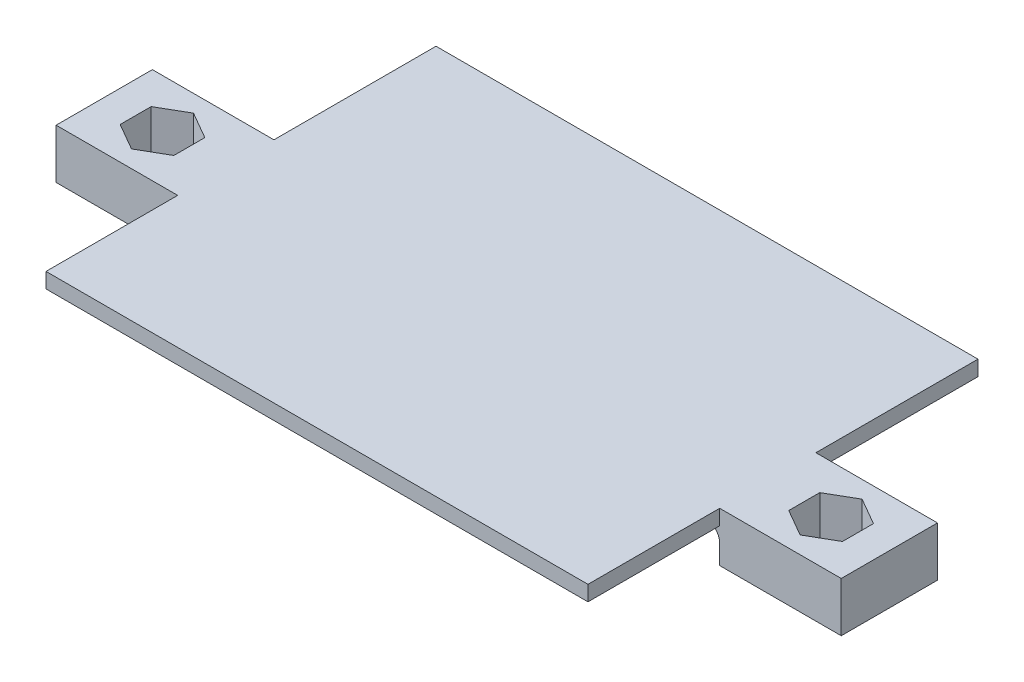
ISO-10303-21;
HEADER;
FILE_DESCRIPTION(('STEP AP214'),'2;1');
FILE_NAME('part.step','',(''),(''),'','','');
FILE_SCHEMA(('AUTOMOTIVE_DESIGN { 1 0 10303 214 1 1 1 1 }'));
ENDSEC;
DATA;
#1=APPLICATION_CONTEXT('core data for automotive mechanical design processes');
#2=APPLICATION_PROTOCOL_DEFINITION('international standard','automotive_design',2000,#1);
#3=PRODUCT_CONTEXT('',#1,'mechanical');
#4=PRODUCT('Part','Part','',(#3));
#5=PRODUCT_RELATED_PRODUCT_CATEGORY('part','',(#4));
#6=PRODUCT_DEFINITION_FORMATION('','',#4);
#7=PRODUCT_DEFINITION_CONTEXT('part definition',#1,'design');
#8=PRODUCT_DEFINITION('design','',#6,#7);
#9=PRODUCT_DEFINITION_SHAPE('','',#8);
#10=(LENGTH_UNIT() NAMED_UNIT(*) SI_UNIT(.MILLI.,.METRE.));
#11=(NAMED_UNIT(*) PLANE_ANGLE_UNIT() SI_UNIT($,.RADIAN.));
#12=(NAMED_UNIT(*) SI_UNIT($,.STERADIAN.) SOLID_ANGLE_UNIT());
#13=UNCERTAINTY_MEASURE_WITH_UNIT(LENGTH_MEASURE(1.E-05),#10,'distance_accuracy_value','');
#14=(GEOMETRIC_REPRESENTATION_CONTEXT(3) GLOBAL_UNCERTAINTY_ASSIGNED_CONTEXT((#13)) GLOBAL_UNIT_ASSIGNED_CONTEXT((#10,
#11,#12)) REPRESENTATION_CONTEXT('',''));
#15=CARTESIAN_POINT('',(0.,0.,0.));
#16=DIRECTION('',(0.,0.,1.));
#17=DIRECTION('',(1.,0.,0.));
#18=AXIS2_PLACEMENT_3D('',#15,#16,#17);
#19=CARTESIAN_POINT('',(26.75,-1.5,-19.25));
#20=DIRECTION('',(-1.,0.,0.));
#21=DIRECTION('',(0.,0.,1.));
#22=AXIS2_PLACEMENT_3D('',#19,#20,#21);
#23=PLANE('',#22);
#24=DIRECTION('',(0.,1.,0.));
#25=VECTOR('',#24,1.);
#26=CARTESIAN_POINT('',(26.75,-4.9,-3.25000000000001));
#27=LINE('',#26,#25);
#28=CARTESIAN_POINT('',(26.75,-1.5,-3.25000000000001));
#29=VERTEX_POINT('',#28);
#30=CARTESIAN_POINT('',(26.75,0.,-3.25000000000001));
#31=VERTEX_POINT('',#30);
#32=EDGE_CURVE('E441',#29,#31,#27,.T.);
#33=ORIENTED_EDGE('',*,*,#32,.F.);
#34=DIRECTION('',(0.,0.,1.));
#35=VECTOR('',#34,1.);
#36=CARTESIAN_POINT('',(26.75,-1.5,-19.25));
#37=LINE('',#36,#35);
#38=CARTESIAN_POINT('',(26.75,-1.5,-19.25));
#39=VERTEX_POINT('',#38);
#40=EDGE_CURVE('E404',#39,#29,#37,.T.);
#41=ORIENTED_EDGE('',*,*,#40,.F.);
#42=DIRECTION('',(0.,1.,0.));
#43=VECTOR('',#42,1.);
#44=CARTESIAN_POINT('',(26.75,-1.5,-19.25));
#45=LINE('',#44,#43);
#46=CARTESIAN_POINT('',(26.75,0.,-19.25));
#47=VERTEX_POINT('',#46);
#48=EDGE_CURVE('E424',#39,#47,#45,.T.);
#49=ORIENTED_EDGE('',*,*,#48,.T.);
#50=DIRECTION('',(0.,0.,1.));
#51=VECTOR('',#50,1.);
#52=CARTESIAN_POINT('',(26.75,0.,-19.25));
#53=LINE('',#52,#51);
#54=EDGE_CURVE('E394',#47,#31,#53,.T.);
#55=ORIENTED_EDGE('',*,*,#54,.T.);
#56=EDGE_LOOP('',(#33,#41,#49,#55));
#57=FACE_BOUND('',#56,.T.);
#58=ADVANCED_FACE('F43',(#57),#23,.F.);
#59=CARTESIAN_POINT('',(-26.75,-1.5,-19.25));
#60=DIRECTION('',(-1.,0.,0.));
#61=DIRECTION('',(0.,0.,1.));
#62=AXIS2_PLACEMENT_3D('',#59,#60,#61);
#63=PLANE('',#62);
#64=DIRECTION('',(0.,0.,1.));
#65=VECTOR('',#64,1.);
#66=CARTESIAN_POINT('',(-26.75,-1.5,-19.25));
#67=LINE('',#66,#65);
#68=CARTESIAN_POINT('',(-26.75,-1.5,-19.25));
#69=VERTEX_POINT('',#68);
#70=CARTESIAN_POINT('',(-26.75,-1.5,-3.25));
#71=VERTEX_POINT('',#70);
#72=EDGE_CURVE('E395',#69,#71,#67,.T.);
#73=ORIENTED_EDGE('',*,*,#72,.T.);
#74=DIRECTION('',(0.,1.,0.));
#75=VECTOR('',#74,1.);
#76=CARTESIAN_POINT('',(-26.75,-4.9,-3.25));
#77=LINE('',#76,#75);
#78=CARTESIAN_POINT('',(-26.75,0.,-3.25));
#79=VERTEX_POINT('',#78);
#80=EDGE_CURVE('E382',#71,#79,#77,.T.);
#81=ORIENTED_EDGE('',*,*,#80,.T.);
#82=DIRECTION('',(0.,0.,1.));
#83=VECTOR('',#82,1.);
#84=CARTESIAN_POINT('',(-26.75,0.,-19.25));
#85=LINE('',#84,#83);
#86=CARTESIAN_POINT('',(-26.75,0.,-19.25));
#87=VERTEX_POINT('',#86);
#88=EDGE_CURVE('E412',#87,#79,#85,.T.);
#89=ORIENTED_EDGE('',*,*,#88,.F.);
#90=DIRECTION('',(0.,1.,0.));
#91=VECTOR('',#90,1.);
#92=CARTESIAN_POINT('',(-26.75,-1.5,-19.25));
#93=LINE('',#92,#91);
#94=EDGE_CURVE('E407',#69,#87,#93,.T.);
#95=ORIENTED_EDGE('',*,*,#94,.F.);
#96=EDGE_LOOP('',(#73,#81,#89,#95));
#97=FACE_BOUND('',#96,.T.);
#98=ADVANCED_FACE('F603',(#97),#63,.T.);
#99=CARTESIAN_POINT('',(26.75,-1.5,-19.25));
#100=DIRECTION('',(0.,0.,-1.));
#101=DIRECTION('',(-1.,0.,0.));
#102=AXIS2_PLACEMENT_3D('',#99,#100,#101);
#103=PLANE('',#102);
#104=DIRECTION('',(-1.,0.,0.));
#105=VECTOR('',#104,1.);
#106=CARTESIAN_POINT('',(26.75,0.,-19.25));
#107=LINE('',#106,#105);
#108=EDGE_CURVE('E376',#47,#87,#107,.T.);
#109=ORIENTED_EDGE('',*,*,#108,.F.);
#110=ORIENTED_EDGE('',*,*,#48,.F.);
#111=DIRECTION('',(-1.,0.,0.));
#112=VECTOR('',#111,1.);
#113=CARTESIAN_POINT('',(26.75,-1.5,-19.25));
#114=LINE('',#113,#112);
#115=EDGE_CURVE('E389',#39,#69,#114,.T.);
#116=ORIENTED_EDGE('',*,*,#115,.T.);
#117=ORIENTED_EDGE('',*,*,#94,.T.);
#118=EDGE_LOOP('',(#109,#110,#116,#117));
#119=FACE_BOUND('',#118,.T.);
#120=ADVANCED_FACE('F608',(#119),#103,.T.);
#121=CARTESIAN_POINT('',(26.75,-1.5,6.25));
#122=VERTEX_POINT('',#121);
#123=CARTESIAN_POINT('',(26.75,-1.5,19.25));
#124=VERTEX_POINT('',#123);
#125=EDGE_CURVE('E403',#122,#124,#37,.T.);
#126=ORIENTED_EDGE('',*,*,#125,.F.);
#127=DIRECTION('',(0.,1.,0.));
#128=VECTOR('',#127,1.);
#129=CARTESIAN_POINT('',(26.75,-4.9,6.25));
#130=LINE('',#129,#128);
#131=CARTESIAN_POINT('',(26.75,0.,6.25));
#132=VERTEX_POINT('',#131);
#133=EDGE_CURVE('E489',#122,#132,#130,.T.);
#134=ORIENTED_EDGE('',*,*,#133,.T.);
#135=CARTESIAN_POINT('',(26.75,0.,19.25));
#136=VERTEX_POINT('',#135);
#137=EDGE_CURVE('E420',#132,#136,#53,.T.);
#138=ORIENTED_EDGE('',*,*,#137,.T.);
#139=DIRECTION('',(0.,1.,0.));
#140=VECTOR('',#139,1.);
#141=CARTESIAN_POINT('',(26.75,-1.5,19.25));
#142=LINE('',#141,#140);
#143=EDGE_CURVE('E427',#124,#136,#142,.T.);
#144=ORIENTED_EDGE('',*,*,#143,.F.);
#145=EDGE_LOOP('',(#126,#134,#138,#144));
#146=FACE_BOUND('',#145,.T.);
#147=ADVANCED_FACE('F604',(#146),#23,.F.);
#148=CARTESIAN_POINT('',(26.75,-1.5,19.25));
#149=DIRECTION('',(0.,0.,-1.));
#150=DIRECTION('',(-1.,0.,0.));
#151=AXIS2_PLACEMENT_3D('',#148,#149,#150);
#152=PLANE('',#151);
#153=DIRECTION('',(-1.,0.,0.));
#154=VECTOR('',#153,1.);
#155=CARTESIAN_POINT('',(26.75,0.,19.25));
#156=LINE('',#155,#154);
#157=CARTESIAN_POINT('',(-26.75,0.,19.25));
#158=VERTEX_POINT('',#157);
#159=EDGE_CURVE('E416',#136,#158,#156,.T.);
#160=ORIENTED_EDGE('',*,*,#159,.T.);
#161=DIRECTION('',(0.,1.,0.));
#162=VECTOR('',#161,1.);
#163=CARTESIAN_POINT('',(-26.75,-1.5,19.25));
#164=LINE('',#163,#162);
#165=CARTESIAN_POINT('',(-26.75,-1.5,19.25));
#166=VERTEX_POINT('',#165);
#167=EDGE_CURVE('E431',#166,#158,#164,.T.);
#168=ORIENTED_EDGE('',*,*,#167,.F.);
#169=DIRECTION('',(-1.,0.,0.));
#170=VECTOR('',#169,1.);
#171=CARTESIAN_POINT('',(26.75,-1.5,19.25));
#172=LINE('',#171,#170);
#173=EDGE_CURVE('E399',#124,#166,#172,.T.);
#174=ORIENTED_EDGE('',*,*,#173,.F.);
#175=ORIENTED_EDGE('',*,*,#143,.T.);
#176=EDGE_LOOP('',(#160,#168,#174,#175));
#177=FACE_BOUND('',#176,.T.);
#178=ADVANCED_FACE('F613',(#177),#152,.F.);
#179=DIRECTION('',(0.,1.,0.));
#180=VECTOR('',#179,1.);
#181=CARTESIAN_POINT('',(-26.75,-4.9,6.25000000000001));
#182=LINE('',#181,#180);
#183=CARTESIAN_POINT('',(-26.75,-1.5,6.25000000000001));
#184=VERTEX_POINT('',#183);
#185=CARTESIAN_POINT('',(-26.75,0.,6.25000000000001));
#186=VERTEX_POINT('',#185);
#187=EDGE_CURVE('E386',#184,#186,#182,.T.);
#188=ORIENTED_EDGE('',*,*,#187,.F.);
#189=EDGE_CURVE('E393',#184,#166,#67,.T.);
#190=ORIENTED_EDGE('',*,*,#189,.T.);
#191=ORIENTED_EDGE('',*,*,#167,.T.);
#192=EDGE_CURVE('E411',#186,#158,#85,.T.);
#193=ORIENTED_EDGE('',*,*,#192,.F.);
#194=EDGE_LOOP('',(#188,#190,#191,#193));
#195=FACE_BOUND('',#194,.T.);
#196=ADVANCED_FACE('F598',(#195),#63,.T.);
#197=CARTESIAN_POINT('',(0.,-1.5,0.));
#198=DIRECTION('',(0.,1.,0.));
#199=DIRECTION('',(0.,0.,1.));
#200=AXIS2_PLACEMENT_3D('',#197,#198,#199);
#201=PLANE('',#200);
#202=ORIENTED_EDGE('',*,*,#189,.F.);
#203=DIRECTION('',(1.,0.,0.));
#204=VECTOR('',#203,1.);
#205=CARTESIAN_POINT('',(0.,-1.5,6.25000000000001));
#206=LINE('',#205,#204);
#207=CARTESIAN_POINT('',(-25.25,-1.5,6.25000000000001));
#208=VERTEX_POINT('',#207);
#209=EDGE_CURVE('E66',#184,#208,#206,.T.);
#210=ORIENTED_EDGE('',*,*,#209,.T.);
#211=DIRECTION('',(0.,0.,1.));
#212=VECTOR('',#211,1.);
#213=CARTESIAN_POINT('',(-25.25,-1.5,0.));
#214=LINE('',#213,#212);
#215=CARTESIAN_POINT('',(-25.25,-1.5,-3.25));
#216=VERTEX_POINT('',#215);
#217=EDGE_CURVE('E454',#208,#216,#214,.F.);
#218=ORIENTED_EDGE('',*,*,#217,.T.);
#219=DIRECTION('',(-1.,0.,0.));
#220=VECTOR('',#219,1.);
#221=CARTESIAN_POINT('',(0.,-1.5,-3.25));
#222=LINE('',#221,#220);
#223=EDGE_CURVE('E451',#216,#71,#222,.T.);
#224=ORIENTED_EDGE('',*,*,#223,.T.);
#225=ORIENTED_EDGE('',*,*,#72,.F.);
#226=ORIENTED_EDGE('',*,*,#115,.F.);
#227=ORIENTED_EDGE('',*,*,#40,.T.);
#228=DIRECTION('',(-1.,0.,0.));
#229=VECTOR('',#228,1.);
#230=CARTESIAN_POINT('',(0.,-1.5,-3.25));
#231=LINE('',#230,#229);
#232=CARTESIAN_POINT('',(25.25,-1.5,-3.25000000000001));
#233=VERTEX_POINT('',#232);
#234=EDGE_CURVE('E58',#29,#233,#231,.T.);
#235=ORIENTED_EDGE('',*,*,#234,.T.);
#236=DIRECTION('',(0.,0.,1.));
#237=VECTOR('',#236,1.);
#238=CARTESIAN_POINT('',(25.25,-1.5,0.));
#239=LINE('',#238,#237);
#240=CARTESIAN_POINT('',(25.25,-1.5,6.25));
#241=VERTEX_POINT('',#240);
#242=EDGE_CURVE('E444',#233,#241,#239,.T.);
#243=ORIENTED_EDGE('',*,*,#242,.T.);
#244=DIRECTION('',(1.,0.,0.));
#245=VECTOR('',#244,1.);
#246=CARTESIAN_POINT('',(0.,-1.5,6.25000000000001));
#247=LINE('',#246,#245);
#248=EDGE_CURVE('E448',#241,#122,#247,.T.);
#249=ORIENTED_EDGE('',*,*,#248,.T.);
#250=ORIENTED_EDGE('',*,*,#125,.T.);
#251=ORIENTED_EDGE('',*,*,#173,.T.);
#252=EDGE_LOOP('',(#202,#210,#218,#224,#225,#226,#227,#235,#243,#249,#250,#251));
#253=FACE_BOUND('',#252,.T.);
#254=ADVANCED_FACE('F495',(#253),#201,.F.);
#255=CARTESIAN_POINT('',(0.,0.,0.));
#256=DIRECTION('',(0.,1.,0.));
#257=DIRECTION('',(0.,0.,1.));
#258=AXIS2_PLACEMENT_3D('',#255,#256,#257);
#259=PLANE('',#258);
#260=ORIENTED_EDGE('',*,*,#108,.T.);
#261=ORIENTED_EDGE('',*,*,#88,.T.);
#262=DIRECTION('',(-1.,0.,0.));
#263=VECTOR('',#262,1.);
#264=CARTESIAN_POINT('',(-38.75,0.,-3.25));
#265=LINE('',#264,#263);
#266=CARTESIAN_POINT('',(-38.75,0.,-3.25));
#267=VERTEX_POINT('',#266);
#268=EDGE_CURVE('E350',#79,#267,#265,.T.);
#269=ORIENTED_EDGE('',*,*,#268,.T.);
#270=DIRECTION('',(0.,0.,1.));
#271=VECTOR('',#270,1.);
#272=CARTESIAN_POINT('',(-38.75,0.,6.25000000000001));
#273=LINE('',#272,#271);
#274=CARTESIAN_POINT('',(-38.75,0.,6.25000000000001));
#275=VERTEX_POINT('',#274);
#276=EDGE_CURVE('E329',#267,#275,#273,.T.);
#277=ORIENTED_EDGE('',*,*,#276,.T.);
#278=DIRECTION('',(1.,0.,0.));
#279=VECTOR('',#278,1.);
#280=CARTESIAN_POINT('',(-38.75,0.,6.25000000000001));
#281=LINE('',#280,#279);
#282=EDGE_CURVE('E366',#275,#186,#281,.T.);
#283=ORIENTED_EDGE('',*,*,#282,.T.);
#284=ORIENTED_EDGE('',*,*,#192,.T.);
#285=ORIENTED_EDGE('',*,*,#159,.F.);
#286=ORIENTED_EDGE('',*,*,#137,.F.);
#287=DIRECTION('',(1.,0.,0.));
#288=VECTOR('',#287,1.);
#289=CARTESIAN_POINT('',(38.75,0.,6.25));
#290=LINE('',#289,#288);
#291=CARTESIAN_POINT('',(38.75,0.,6.25));
#292=VERTEX_POINT('',#291);
#293=EDGE_CURVE('E524',#132,#292,#290,.T.);
#294=ORIENTED_EDGE('',*,*,#293,.T.);
#295=DIRECTION('',(0.,0.,-1.));
#296=VECTOR('',#295,1.);
#297=CARTESIAN_POINT('',(38.75,0.,6.25));
#298=LINE('',#297,#296);
#299=CARTESIAN_POINT('',(38.75,0.,-3.25000000000001));
#300=VERTEX_POINT('',#299);
#301=EDGE_CURVE('E986',#292,#300,#298,.T.);
#302=ORIENTED_EDGE('',*,*,#301,.T.);
#303=DIRECTION('',(-1.,0.,0.));
#304=VECTOR('',#303,1.);
#305=CARTESIAN_POINT('',(38.75,0.,-3.25000000000001));
#306=LINE('',#305,#304);
#307=EDGE_CURVE('E532',#300,#31,#306,.T.);
#308=ORIENTED_EDGE('',*,*,#307,.T.);
#309=ORIENTED_EDGE('',*,*,#54,.F.);
#310=EDGE_LOOP('',(#260,#261,#269,#277,#283,#284,#285,#286,#294,#302,#308,#309));
#311=FACE_BOUND('',#310,.T.);
#312=DIRECTION('',(0.866025403784439,0.,-0.499999999999999));
#313=VECTOR('',#312,1.);
#314=CARTESIAN_POINT('',(-33.,0.,4.55995642670502));
#315=LINE('',#314,#313);
#316=CARTESIAN_POINT('',(-33.,0.,4.55995642670502));
#317=VERTEX_POINT('',#316);
#318=CARTESIAN_POINT('',(-30.35,0.,3.02997821335251));
#319=VERTEX_POINT('',#318);
#320=EDGE_CURVE('E306',#317,#319,#315,.T.);
#321=ORIENTED_EDGE('',*,*,#320,.F.);
#322=DIRECTION('',(0.866025403784438,0.,0.5));
#323=VECTOR('',#322,1.);
#324=CARTESIAN_POINT('',(-35.65,0.,3.02997821335251));
#325=LINE('',#324,#323);
#326=CARTESIAN_POINT('',(-35.65,0.,3.02997821335251));
#327=VERTEX_POINT('',#326);
#328=EDGE_CURVE('E303',#327,#317,#325,.T.);
#329=ORIENTED_EDGE('',*,*,#328,.F.);
#330=DIRECTION('',(0.,0.,1.));
#331=VECTOR('',#330,1.);
#332=CARTESIAN_POINT('',(-35.65,0.,-0.0299782133525008));
#333=LINE('',#332,#331);
#334=CARTESIAN_POINT('',(-35.65,0.,-0.0299782133525008));
#335=VERTEX_POINT('',#334);
#336=EDGE_CURVE('E282',#335,#327,#333,.T.);
#337=ORIENTED_EDGE('',*,*,#336,.F.);
#338=DIRECTION('',(-0.866025403784439,0.,0.5));
#339=VECTOR('',#338,1.);
#340=CARTESIAN_POINT('',(-33.,0.,-1.55995642670501));
#341=LINE('',#340,#339);
#342=CARTESIAN_POINT('',(-33.,0.,-1.55995642670501));
#343=VERTEX_POINT('',#342);
#344=EDGE_CURVE('E319',#343,#335,#341,.T.);
#345=ORIENTED_EDGE('',*,*,#344,.F.);
#346=DIRECTION('',(-0.866025403784439,0.,-0.5));
#347=VECTOR('',#346,1.);
#348=CARTESIAN_POINT('',(-30.35,0.,-0.0299782133525071));
#349=LINE('',#348,#347);
#350=CARTESIAN_POINT('',(-30.35,0.,-0.0299782133525071));
#351=VERTEX_POINT('',#350);
#352=EDGE_CURVE('E315',#351,#343,#349,.T.);
#353=ORIENTED_EDGE('',*,*,#352,.F.);
#354=DIRECTION('',(0.,0.,-1.));
#355=VECTOR('',#354,1.);
#356=CARTESIAN_POINT('',(-30.35,0.,3.02997821335251));
#357=LINE('',#356,#355);
#358=EDGE_CURVE('E311',#319,#351,#357,.T.);
#359=ORIENTED_EDGE('',*,*,#358,.F.);
#360=EDGE_LOOP('',(#321,#329,#337,#345,#353,#359));
#361=FACE_BOUND('',#360,.T.);
#362=DIRECTION('',(0.,0.,-1.));
#363=VECTOR('',#362,1.);
#364=CARTESIAN_POINT('',(35.65,0.,-0.0299782133525097));
#365=LINE('',#364,#363);
#366=CARTESIAN_POINT('',(35.65,0.,3.0299782133525));
#367=VERTEX_POINT('',#366);
#368=CARTESIAN_POINT('',(35.65,0.,-0.0299782133525075));
#369=VERTEX_POINT('',#368);
#370=EDGE_CURVE('E307',#367,#369,#365,.T.);
#371=ORIENTED_EDGE('',*,*,#370,.F.);
#372=DIRECTION('',(0.866025403784438,0.,-0.500000000000001));
#373=VECTOR('',#372,1.);
#374=CARTESIAN_POINT('',(35.65,0.,3.0299782133525));
#375=LINE('',#374,#373);
#376=CARTESIAN_POINT('',(33.,0.,4.55995642670501));
#377=VERTEX_POINT('',#376);
#378=EDGE_CURVE('E273',#377,#367,#375,.T.);
#379=ORIENTED_EDGE('',*,*,#378,.F.);
#380=DIRECTION('',(0.866025403784438,0.,0.5));
#381=VECTOR('',#380,1.);
#382=CARTESIAN_POINT('',(33.,0.,4.55995642670501));
#383=LINE('',#382,#381);
#384=CARTESIAN_POINT('',(30.35,0.,3.0299782133525));
#385=VERTEX_POINT('',#384);
#386=EDGE_CURVE('E550',#385,#377,#383,.T.);
#387=ORIENTED_EDGE('',*,*,#386,.F.);
#388=DIRECTION('',(0.,0.,1.));
#389=VECTOR('',#388,1.);
#390=CARTESIAN_POINT('',(30.35,0.,3.0299782133525));
#391=LINE('',#390,#389);
#392=CARTESIAN_POINT('',(30.35,0.,-0.0299782133525146));
#393=VERTEX_POINT('',#392);
#394=EDGE_CURVE('E554',#393,#385,#391,.T.);
#395=ORIENTED_EDGE('',*,*,#394,.F.);
#396=DIRECTION('',(-0.866025403784438,0.,0.500000000000001));
#397=VECTOR('',#396,1.);
#398=CARTESIAN_POINT('',(30.35,0.,-0.0299782133525146));
#399=LINE('',#398,#397);
#400=CARTESIAN_POINT('',(33.,0.,-1.55995642670502));
#401=VERTEX_POINT('',#400);
#402=EDGE_CURVE('E558',#401,#393,#399,.T.);
#403=ORIENTED_EDGE('',*,*,#402,.F.);
#404=DIRECTION('',(-0.866025403784439,0.,-0.5));
#405=VECTOR('',#404,1.);
#406=CARTESIAN_POINT('',(33.,0.,-1.55995642670502));
#407=LINE('',#406,#405);
#408=EDGE_CURVE('E260',#369,#401,#407,.T.);
#409=ORIENTED_EDGE('',*,*,#408,.F.);
#410=EDGE_LOOP('',(#371,#379,#387,#395,#403,#409));
#411=FACE_BOUND('',#410,.T.);
#412=ADVANCED_FACE('F586',(#311,#361,#411),#259,.T.);
#413=CARTESIAN_POINT('',(-38.75,-4.9,6.25000000000001));
#414=DIRECTION('',(-1.,0.,0.));
#415=DIRECTION('',(0.,0.,1.));
#416=AXIS2_PLACEMENT_3D('',#413,#414,#415);
#417=PLANE('',#416);
#418=ORIENTED_EDGE('',*,*,#276,.F.);
#419=DIRECTION('',(0.,1.,0.));
#420=VECTOR('',#419,1.);
#421=CARTESIAN_POINT('',(-38.75,-4.9,-3.25));
#422=LINE('',#421,#420);
#423=CARTESIAN_POINT('',(-38.75,-4.9,-3.25));
#424=VERTEX_POINT('',#423);
#425=EDGE_CURVE('E373',#424,#267,#422,.T.);
#426=ORIENTED_EDGE('',*,*,#425,.F.);
#427=DIRECTION('',(0.,0.,1.));
#428=VECTOR('',#427,1.);
#429=CARTESIAN_POINT('',(-38.75,-4.9,6.25000000000001));
#430=LINE('',#429,#428);
#431=CARTESIAN_POINT('',(-38.75,-4.9,6.25000000000001));
#432=VERTEX_POINT('',#431);
#433=EDGE_CURVE('E345',#424,#432,#430,.T.);
#434=ORIENTED_EDGE('',*,*,#433,.T.);
#435=DIRECTION('',(0.,1.,0.));
#436=VECTOR('',#435,1.);
#437=CARTESIAN_POINT('',(-38.75,-4.9,6.25000000000001));
#438=LINE('',#437,#436);
#439=EDGE_CURVE('E362',#432,#275,#438,.T.);
#440=ORIENTED_EDGE('',*,*,#439,.T.);
#441=EDGE_LOOP('',(#418,#426,#434,#440));
#442=FACE_BOUND('',#441,.T.);
#443=ADVANCED_FACE('F588',(#442),#417,.T.);
#444=CARTESIAN_POINT('',(-38.75,-4.9,-3.25));
#445=DIRECTION('',(0.,0.,-1.));
#446=DIRECTION('',(-1.,0.,0.));
#447=AXIS2_PLACEMENT_3D('',#444,#445,#446);
#448=PLANE('',#447);
#449=ORIENTED_EDGE('',*,*,#268,.F.);
#450=ORIENTED_EDGE('',*,*,#80,.F.);
#451=ORIENTED_EDGE('',*,*,#223,.F.);
#452=CARTESIAN_POINT('',(-25.25,-3.,-3.25));
#453=DIRECTION('',(0.,0.,-1.));
#454=DIRECTION('',(-1.,0.,0.));
#455=AXIS2_PLACEMENT_3D('',#452,#453,#454);
#456=CIRCLE('',#455,1.5);
#457=CARTESIAN_POINT('',(-26.75,-3.,-3.25));
#458=VERTEX_POINT('',#457);
#459=EDGE_CURVE('E466',#216,#458,#456,.F.);
#460=ORIENTED_EDGE('',*,*,#459,.T.);
#461=CARTESIAN_POINT('',(-26.75,-4.9,-3.25));
#462=VERTEX_POINT('',#461);
#463=EDGE_CURVE('E377',#462,#458,#77,.T.);
#464=ORIENTED_EDGE('',*,*,#463,.F.);
#465=DIRECTION('',(-1.,0.,0.));
#466=VECTOR('',#465,1.);
#467=CARTESIAN_POINT('',(-38.75,-4.9,-3.25));
#468=LINE('',#467,#466);
#469=EDGE_CURVE('E358',#462,#424,#468,.T.);
#470=ORIENTED_EDGE('',*,*,#469,.T.);
#471=ORIENTED_EDGE('',*,*,#425,.T.);
#472=EDGE_LOOP('',(#449,#450,#451,#460,#464,#470,#471));
#473=FACE_BOUND('',#472,.T.);
#474=ADVANCED_FACE('F595',(#473),#448,.T.);
#475=CARTESIAN_POINT('',(-26.75,-4.9,-3.25));
#476=DIRECTION('',(1.,0.,0.));
#477=DIRECTION('',(0.,0.,-1.));
#478=AXIS2_PLACEMENT_3D('',#475,#476,#477);
#479=PLANE('',#478);
#480=ORIENTED_EDGE('',*,*,#463,.T.);
#481=DIRECTION('',(0.,0.,1.));
#482=VECTOR('',#481,1.);
#483=CARTESIAN_POINT('',(-26.75,-3.,-3.25));
#484=LINE('',#483,#482);
#485=CARTESIAN_POINT('',(-26.75,-3.,6.25000000000001));
#486=VERTEX_POINT('',#485);
#487=EDGE_CURVE('E437',#458,#486,#484,.T.);
#488=ORIENTED_EDGE('',*,*,#487,.T.);
#489=CARTESIAN_POINT('',(-26.75,-4.9,6.25000000000001));
#490=VERTEX_POINT('',#489);
#491=EDGE_CURVE('E381',#490,#486,#182,.T.);
#492=ORIENTED_EDGE('',*,*,#491,.F.);
#493=DIRECTION('',(0.,0.,-1.));
#494=VECTOR('',#493,1.);
#495=CARTESIAN_POINT('',(-26.75,-4.9,-3.25));
#496=LINE('',#495,#494);
#497=EDGE_CURVE('E354',#490,#462,#496,.T.);
#498=ORIENTED_EDGE('',*,*,#497,.T.);
#499=EDGE_LOOP('',(#480,#488,#492,#498));
#500=FACE_BOUND('',#499,.T.);
#501=ADVANCED_FACE('F648',(#500),#479,.T.);
#502=CARTESIAN_POINT('',(-38.75,-4.9,6.25000000000001));
#503=DIRECTION('',(0.,0.,1.));
#504=DIRECTION('',(1.,0.,0.));
#505=AXIS2_PLACEMENT_3D('',#502,#503,#504);
#506=PLANE('',#505);
#507=ORIENTED_EDGE('',*,*,#282,.F.);
#508=ORIENTED_EDGE('',*,*,#439,.F.);
#509=DIRECTION('',(1.,0.,0.));
#510=VECTOR('',#509,1.);
#511=CARTESIAN_POINT('',(-38.75,-4.9,6.25000000000001));
#512=LINE('',#511,#510);
#513=EDGE_CURVE('E349',#432,#490,#512,.T.);
#514=ORIENTED_EDGE('',*,*,#513,.T.);
#515=ORIENTED_EDGE('',*,*,#491,.T.);
#516=CARTESIAN_POINT('',(-25.25,-3.,6.25000000000001));
#517=DIRECTION('',(0.,0.,1.));
#518=DIRECTION('',(1.,0.,0.));
#519=AXIS2_PLACEMENT_3D('',#516,#517,#518);
#520=CIRCLE('',#519,1.5);
#521=EDGE_CURVE('E463',#486,#208,#520,.F.);
#522=ORIENTED_EDGE('',*,*,#521,.T.);
#523=ORIENTED_EDGE('',*,*,#209,.F.);
#524=ORIENTED_EDGE('',*,*,#187,.T.);
#525=EDGE_LOOP('',(#507,#508,#514,#515,#522,#523,#524));
#526=FACE_BOUND('',#525,.T.);
#527=ADVANCED_FACE('F652',(#526),#506,.T.);
#528=CARTESIAN_POINT('',(0.,-4.9,0.));
#529=DIRECTION('',(0.,-1.,0.));
#530=DIRECTION('',(0.,0.,-1.));
#531=AXIS2_PLACEMENT_3D('',#528,#529,#530);
#532=PLANE('',#531);
#533=DIRECTION('',(0.866025403784438,0.,0.5));
#534=VECTOR('',#533,1.);
#535=CARTESIAN_POINT('',(-35.65,-4.9,3.02997821335251));
#536=LINE('',#535,#534);
#537=CARTESIAN_POINT('',(-35.65,-4.9,3.02997821335251));
#538=VERTEX_POINT('',#537);
#539=CARTESIAN_POINT('',(-33.,-4.9,4.55995642670502));
#540=VERTEX_POINT('',#539);
#541=EDGE_CURVE('E277',#538,#540,#536,.T.);
#542=ORIENTED_EDGE('',*,*,#541,.T.);
#543=DIRECTION('',(0.866025403784439,0.,-0.499999999999999));
#544=VECTOR('',#543,1.);
#545=CARTESIAN_POINT('',(-33.,-4.9,4.55995642670502));
#546=LINE('',#545,#544);
#547=CARTESIAN_POINT('',(-30.35,-4.9,3.02997821335251));
#548=VERTEX_POINT('',#547);
#549=EDGE_CURVE('E281',#540,#548,#546,.T.);
#550=ORIENTED_EDGE('',*,*,#549,.T.);
#551=DIRECTION('',(0.,0.,-1.));
#552=VECTOR('',#551,1.);
#553=CARTESIAN_POINT('',(-30.35,-4.9,3.02997821335251));
#554=LINE('',#553,#552);
#555=CARTESIAN_POINT('',(-30.35,-4.9,-0.0299782133525071));
#556=VERTEX_POINT('',#555);
#557=EDGE_CURVE('E286',#548,#556,#554,.T.);
#558=ORIENTED_EDGE('',*,*,#557,.T.);
#559=DIRECTION('',(-0.866025403784439,0.,-0.5));
#560=VECTOR('',#559,1.);
#561=CARTESIAN_POINT('',(-30.35,-4.9,-0.0299782133525071));
#562=LINE('',#561,#560);
#563=CARTESIAN_POINT('',(-33.,-4.9,-1.55995642670501));
#564=VERTEX_POINT('',#563);
#565=EDGE_CURVE('E290',#556,#564,#562,.T.);
#566=ORIENTED_EDGE('',*,*,#565,.T.);
#567=DIRECTION('',(-0.866025403784439,0.,0.5));
#568=VECTOR('',#567,1.);
#569=CARTESIAN_POINT('',(-33.,-4.9,-1.55995642670501));
#570=LINE('',#569,#568);
#571=CARTESIAN_POINT('',(-35.65,-4.9,-0.0299782133525008));
#572=VERTEX_POINT('',#571);
#573=EDGE_CURVE('E294',#564,#572,#570,.T.);
#574=ORIENTED_EDGE('',*,*,#573,.T.);
#575=DIRECTION('',(0.,0.,1.));
#576=VECTOR('',#575,1.);
#577=CARTESIAN_POINT('',(-35.65,-4.9,-0.0299782133525008));
#578=LINE('',#577,#576);
#579=EDGE_CURVE('E298',#572,#538,#578,.T.);
#580=ORIENTED_EDGE('',*,*,#579,.T.);
#581=EDGE_LOOP('',(#542,#550,#558,#566,#574,#580));
#582=FACE_BOUND('',#581,.T.);
#583=ORIENTED_EDGE('',*,*,#433,.F.);
#584=ORIENTED_EDGE('',*,*,#469,.F.);
#585=ORIENTED_EDGE('',*,*,#497,.F.);
#586=ORIENTED_EDGE('',*,*,#513,.F.);
#587=EDGE_LOOP('',(#583,#584,#585,#586));
#588=FACE_BOUND('',#587,.T.);
#589=ADVANCED_FACE('F656',(#582,#588),#532,.T.);
#590=CARTESIAN_POINT('',(-35.65,-4.9,3.02997821335251));
#591=DIRECTION('',(-0.500000000000001,0.,0.866025403784438));
#592=DIRECTION('',(0.866025403784438,0.,0.500000000000001));
#593=AXIS2_PLACEMENT_3D('',#590,#591,#592);
#594=PLANE('',#593);
#595=ORIENTED_EDGE('',*,*,#328,.T.);
#596=DIRECTION('',(0.,1.,0.));
#597=VECTOR('',#596,1.);
#598=CARTESIAN_POINT('',(-33.,-4.9,4.55995642670502));
#599=LINE('',#598,#597);
#600=EDGE_CURVE('E302',#540,#317,#599,.T.);
#601=ORIENTED_EDGE('',*,*,#600,.F.);
#602=ORIENTED_EDGE('',*,*,#541,.F.);
#603=DIRECTION('',(0.,1.,0.));
#604=VECTOR('',#603,1.);
#605=CARTESIAN_POINT('',(-35.65,-4.9,3.02997821335251));
#606=LINE('',#605,#604);
#607=EDGE_CURVE('E326',#538,#327,#606,.T.);
#608=ORIENTED_EDGE('',*,*,#607,.T.);
#609=EDGE_LOOP('',(#595,#601,#602,#608));
#610=FACE_BOUND('',#609,.T.);
#611=ADVANCED_FACE('F659',(#610),#594,.F.);
#612=CARTESIAN_POINT('',(-35.65,-4.9,-0.0299782133525008));
#613=DIRECTION('',(-1.,0.,0.));
#614=DIRECTION('',(0.,0.,1.));
#615=AXIS2_PLACEMENT_3D('',#612,#613,#614);
#616=PLANE('',#615);
#617=ORIENTED_EDGE('',*,*,#336,.T.);
#618=ORIENTED_EDGE('',*,*,#607,.F.);
#619=ORIENTED_EDGE('',*,*,#579,.F.);
#620=DIRECTION('',(0.,1.,0.));
#621=VECTOR('',#620,1.);
#622=CARTESIAN_POINT('',(-35.65,-4.9,-0.0299782133525008));
#623=LINE('',#622,#621);
#624=EDGE_CURVE('E330',#572,#335,#623,.T.);
#625=ORIENTED_EDGE('',*,*,#624,.T.);
#626=EDGE_LOOP('',(#617,#618,#619,#625));
#627=FACE_BOUND('',#626,.T.);
#628=ADVANCED_FACE('F666',(#627),#616,.F.);
#629=CARTESIAN_POINT('',(-33.,-4.9,-1.55995642670501));
#630=DIRECTION('',(-0.5,0.,-0.866025403784439));
#631=DIRECTION('',(-0.866025403784439,0.,0.5));
#632=AXIS2_PLACEMENT_3D('',#629,#630,#631);
#633=PLANE('',#632);
#634=ORIENTED_EDGE('',*,*,#344,.T.);
#635=ORIENTED_EDGE('',*,*,#624,.F.);
#636=ORIENTED_EDGE('',*,*,#573,.F.);
#637=DIRECTION('',(0.,1.,0.));
#638=VECTOR('',#637,1.);
#639=CARTESIAN_POINT('',(-33.,-4.9,-1.55995642670501));
#640=LINE('',#639,#638);
#641=EDGE_CURVE('E333',#564,#343,#640,.T.);
#642=ORIENTED_EDGE('',*,*,#641,.T.);
#643=EDGE_LOOP('',(#634,#635,#636,#642));
#644=FACE_BOUND('',#643,.T.);
#645=ADVANCED_FACE('F827',(#644),#633,.F.);
#646=CARTESIAN_POINT('',(-30.35,-4.9,-0.0299782133525071));
#647=DIRECTION('',(0.5,0.,-0.866025403784439));
#648=DIRECTION('',(-0.866025403784439,0.,-0.5));
#649=AXIS2_PLACEMENT_3D('',#646,#647,#648);
#650=PLANE('',#649);
#651=ORIENTED_EDGE('',*,*,#352,.T.);
#652=ORIENTED_EDGE('',*,*,#641,.F.);
#653=ORIENTED_EDGE('',*,*,#565,.F.);
#654=DIRECTION('',(0.,1.,0.));
#655=VECTOR('',#654,1.);
#656=CARTESIAN_POINT('',(-30.35,-4.9,-0.0299782133525071));
#657=LINE('',#656,#655);
#658=EDGE_CURVE('E336',#556,#351,#657,.T.);
#659=ORIENTED_EDGE('',*,*,#658,.T.);
#660=EDGE_LOOP('',(#651,#652,#653,#659));
#661=FACE_BOUND('',#660,.T.);
#662=ADVANCED_FACE('F817',(#661),#650,.F.);
#663=CARTESIAN_POINT('',(-30.35,-4.9,3.02997821335251));
#664=DIRECTION('',(1.,0.,0.));
#665=DIRECTION('',(0.,0.,-1.));
#666=AXIS2_PLACEMENT_3D('',#663,#664,#665);
#667=PLANE('',#666);
#668=ORIENTED_EDGE('',*,*,#358,.T.);
#669=ORIENTED_EDGE('',*,*,#658,.F.);
#670=ORIENTED_EDGE('',*,*,#557,.F.);
#671=DIRECTION('',(0.,1.,0.));
#672=VECTOR('',#671,1.);
#673=CARTESIAN_POINT('',(-30.35,-4.9,3.02997821335251));
#674=LINE('',#673,#672);
#675=EDGE_CURVE('E339',#548,#319,#674,.T.);
#676=ORIENTED_EDGE('',*,*,#675,.T.);
#677=EDGE_LOOP('',(#668,#669,#670,#676));
#678=FACE_BOUND('',#677,.T.);
#679=ADVANCED_FACE('F808',(#678),#667,.F.);
#680=CARTESIAN_POINT('',(-33.,-4.9,4.55995642670502));
#681=DIRECTION('',(0.499999999999999,0.,0.866025403784439));
#682=DIRECTION('',(0.866025403784439,0.,-0.499999999999999));
#683=AXIS2_PLACEMENT_3D('',#680,#681,#682);
#684=PLANE('',#683);
#685=ORIENTED_EDGE('',*,*,#320,.T.);
#686=ORIENTED_EDGE('',*,*,#675,.F.);
#687=ORIENTED_EDGE('',*,*,#549,.F.);
#688=ORIENTED_EDGE('',*,*,#600,.T.);
#689=EDGE_LOOP('',(#685,#686,#687,#688));
#690=FACE_BOUND('',#689,.T.);
#691=ADVANCED_FACE('F694',(#690),#684,.F.);
#692=CARTESIAN_POINT('',(26.75,-4.9,-3.25000000000001));
#693=DIRECTION('',(-1.,0.,0.));
#694=DIRECTION('',(0.,0.,1.));
#695=AXIS2_PLACEMENT_3D('',#692,#693,#694);
#696=PLANE('',#695);
#697=CARTESIAN_POINT('',(26.75,-4.9,6.25));
#698=VERTEX_POINT('',#697);
#699=CARTESIAN_POINT('',(26.75,-3.,6.25));
#700=VERTEX_POINT('',#699);
#701=EDGE_CURVE('E474',#698,#700,#130,.T.);
#702=ORIENTED_EDGE('',*,*,#701,.T.);
#703=DIRECTION('',(0.,0.,1.));
#704=VECTOR('',#703,1.);
#705=CARTESIAN_POINT('',(26.75,-3.,-3.25000000000001));
#706=LINE('',#705,#704);
#707=CARTESIAN_POINT('',(26.75,-3.,-3.25000000000001));
#708=VERTEX_POINT('',#707);
#709=EDGE_CURVE('E460',#700,#708,#706,.F.);
#710=ORIENTED_EDGE('',*,*,#709,.T.);
#711=CARTESIAN_POINT('',(26.75,-4.9,-3.25000000000001));
#712=VERTEX_POINT('',#711);
#713=EDGE_CURVE('E487',#712,#708,#27,.T.);
#714=ORIENTED_EDGE('',*,*,#713,.F.);
#715=DIRECTION('',(0.,0.,1.));
#716=VECTOR('',#715,1.);
#717=CARTESIAN_POINT('',(26.75,-4.9,-3.25000000000001));
#718=LINE('',#717,#716);
#719=EDGE_CURVE('E485',#712,#698,#718,.T.);
#720=ORIENTED_EDGE('',*,*,#719,.T.);
#721=EDGE_LOOP('',(#702,#710,#714,#720));
#722=FACE_BOUND('',#721,.T.);
#723=ADVANCED_FACE('F482',(#722),#696,.T.);
#724=CARTESIAN_POINT('',(38.75,-4.9,6.25));
#725=DIRECTION('',(0.,0.,1.));
#726=DIRECTION('',(1.,0.,0.));
#727=AXIS2_PLACEMENT_3D('',#724,#725,#726);
#728=PLANE('',#727);
#729=ORIENTED_EDGE('',*,*,#293,.F.);
#730=ORIENTED_EDGE('',*,*,#133,.F.);
#731=ORIENTED_EDGE('',*,*,#248,.F.);
#732=CARTESIAN_POINT('',(25.25,-3.,6.25));
#733=DIRECTION('',(0.,0.,1.));
#734=DIRECTION('',(1.,0.,0.));
#735=AXIS2_PLACEMENT_3D('',#732,#733,#734);
#736=CIRCLE('',#735,1.5);
#737=EDGE_CURVE('E52',#241,#700,#736,.F.);
#738=ORIENTED_EDGE('',*,*,#737,.T.);
#739=ORIENTED_EDGE('',*,*,#701,.F.);
#740=DIRECTION('',(1.,0.,0.));
#741=VECTOR('',#740,1.);
#742=CARTESIAN_POINT('',(38.75,-4.9,6.25));
#743=LINE('',#742,#741);
#744=CARTESIAN_POINT('',(38.75,-4.9,6.25));
#745=VERTEX_POINT('',#744);
#746=EDGE_CURVE('E529',#698,#745,#743,.T.);
#747=ORIENTED_EDGE('',*,*,#746,.T.);
#748=DIRECTION('',(0.,1.,0.));
#749=VECTOR('',#748,1.);
#750=CARTESIAN_POINT('',(38.75,-4.9,6.25));
#751=LINE('',#750,#749);
#752=EDGE_CURVE('E511',#745,#292,#751,.T.);
#753=ORIENTED_EDGE('',*,*,#752,.T.);
#754=EDGE_LOOP('',(#729,#730,#731,#738,#739,#747,#753));
#755=FACE_BOUND('',#754,.T.);
#756=ADVANCED_FACE('F472',(#755),#728,.T.);
#757=CARTESIAN_POINT('',(38.75,-4.9,-3.25000000000001));
#758=DIRECTION('',(0.,0.,-1.));
#759=DIRECTION('',(-1.,0.,0.));
#760=AXIS2_PLACEMENT_3D('',#757,#758,#759);
#761=PLANE('',#760);
#762=ORIENTED_EDGE('',*,*,#307,.F.);
#763=DIRECTION('',(0.,1.,0.));
#764=VECTOR('',#763,1.);
#765=CARTESIAN_POINT('',(38.75,-4.9,-3.25000000000001));
#766=LINE('',#765,#764);
#767=CARTESIAN_POINT('',(38.75,-4.9,-3.25000000000001));
#768=VERTEX_POINT('',#767);
#769=EDGE_CURVE('E509',#768,#300,#766,.T.);
#770=ORIENTED_EDGE('',*,*,#769,.F.);
#771=DIRECTION('',(-1.,0.,0.));
#772=VECTOR('',#771,1.);
#773=CARTESIAN_POINT('',(38.75,-4.9,-3.25000000000001));
#774=LINE('',#773,#772);
#775=EDGE_CURVE('E518',#768,#712,#774,.T.);
#776=ORIENTED_EDGE('',*,*,#775,.T.);
#777=ORIENTED_EDGE('',*,*,#713,.T.);
#778=CARTESIAN_POINT('',(25.25,-3.,-3.25000000000001));
#779=DIRECTION('',(0.,0.,-1.));
#780=DIRECTION('',(-1.,0.,0.));
#781=AXIS2_PLACEMENT_3D('',#778,#779,#780);
#782=CIRCLE('',#781,1.5);
#783=EDGE_CURVE('E11',#708,#233,#782,.F.);
#784=ORIENTED_EDGE('',*,*,#783,.T.);
#785=ORIENTED_EDGE('',*,*,#234,.F.);
#786=ORIENTED_EDGE('',*,*,#32,.T.);
#787=EDGE_LOOP('',(#762,#770,#776,#777,#784,#785,#786));
#788=FACE_BOUND('',#787,.T.);
#789=ADVANCED_FACE('F492',(#788),#761,.T.);
#790=CARTESIAN_POINT('',(38.75,-4.9,6.25));
#791=DIRECTION('',(1.,0.,0.));
#792=DIRECTION('',(0.,0.,-1.));
#793=AXIS2_PLACEMENT_3D('',#790,#791,#792);
#794=PLANE('',#793);
#795=ORIENTED_EDGE('',*,*,#301,.F.);
#796=ORIENTED_EDGE('',*,*,#752,.F.);
#797=DIRECTION('',(0.,0.,-1.));
#798=VECTOR('',#797,1.);
#799=CARTESIAN_POINT('',(38.75,-4.9,6.25));
#800=LINE('',#799,#798);
#801=EDGE_CURVE('E521',#745,#768,#800,.T.);
#802=ORIENTED_EDGE('',*,*,#801,.T.);
#803=ORIENTED_EDGE('',*,*,#769,.T.);
#804=EDGE_LOOP('',(#795,#796,#802,#803));
#805=FACE_BOUND('',#804,.T.);
#806=ADVANCED_FACE('F715',(#805),#794,.T.);
#807=CARTESIAN_POINT('',(0.,-4.9,0.));
#808=DIRECTION('',(0.,1.,0.));
#809=DIRECTION('',(0.,0.,1.));
#810=AXIS2_PLACEMENT_3D('',#807,#808,#809);
#811=PLANE('',#810);
#812=DIRECTION('',(0.866025403784438,0.,-0.500000000000001));
#813=VECTOR('',#812,1.);
#814=CARTESIAN_POINT('',(35.65,-4.9,3.0299782133525));
#815=LINE('',#814,#813);
#816=CARTESIAN_POINT('',(33.,-4.9,4.55995642670501));
#817=VERTEX_POINT('',#816);
#818=CARTESIAN_POINT('',(35.65,-4.9,3.0299782133525));
#819=VERTEX_POINT('',#818);
#820=EDGE_CURVE('E534',#817,#819,#815,.T.);
#821=ORIENTED_EDGE('',*,*,#820,.T.);
#822=DIRECTION('',(0.,0.,-1.));
#823=VECTOR('',#822,1.);
#824=CARTESIAN_POINT('',(35.65,-4.9,-0.0299782133525097));
#825=LINE('',#824,#823);
#826=CARTESIAN_POINT('',(35.65,-4.9,-0.0299782133525097));
#827=VERTEX_POINT('',#826);
#828=EDGE_CURVE('E269',#819,#827,#825,.T.);
#829=ORIENTED_EDGE('',*,*,#828,.T.);
#830=DIRECTION('',(-0.866025403784439,0.,-0.5));
#831=VECTOR('',#830,1.);
#832=CARTESIAN_POINT('',(33.,-4.9,-1.55995642670502));
#833=LINE('',#832,#831);
#834=CARTESIAN_POINT('',(33.,-4.9,-1.55995642670502));
#835=VERTEX_POINT('',#834);
#836=EDGE_CURVE('E251',#827,#835,#833,.T.);
#837=ORIENTED_EDGE('',*,*,#836,.T.);
#838=DIRECTION('',(-0.866025403784438,0.,0.500000000000001));
#839=VECTOR('',#838,1.);
#840=CARTESIAN_POINT('',(30.35,-4.9,-0.0299782133525146));
#841=LINE('',#840,#839);
#842=CARTESIAN_POINT('',(30.35,-4.9,-0.0299782133525146));
#843=VERTEX_POINT('',#842);
#844=EDGE_CURVE('E239',#835,#843,#841,.T.);
#845=ORIENTED_EDGE('',*,*,#844,.T.);
#846=DIRECTION('',(0.,0.,1.));
#847=VECTOR('',#846,1.);
#848=CARTESIAN_POINT('',(30.35,-4.9,3.0299782133525));
#849=LINE('',#848,#847);
#850=CARTESIAN_POINT('',(30.35,-4.9,3.0299782133525));
#851=VERTEX_POINT('',#850);
#852=EDGE_CURVE('E252',#843,#851,#849,.T.);
#853=ORIENTED_EDGE('',*,*,#852,.T.);
#854=DIRECTION('',(0.866025403784438,0.,0.5));
#855=VECTOR('',#854,1.);
#856=CARTESIAN_POINT('',(33.,-4.9,4.55995642670501));
#857=LINE('',#856,#855);
#858=EDGE_CURVE('E567',#851,#817,#857,.T.);
#859=ORIENTED_EDGE('',*,*,#858,.T.);
#860=EDGE_LOOP('',(#821,#829,#837,#845,#853,#859));
#861=FACE_BOUND('',#860,.T.);
#862=ORIENTED_EDGE('',*,*,#746,.F.);
#863=ORIENTED_EDGE('',*,*,#719,.F.);
#864=ORIENTED_EDGE('',*,*,#775,.F.);
#865=ORIENTED_EDGE('',*,*,#801,.F.);
#866=EDGE_LOOP('',(#862,#863,#864,#865));
#867=FACE_BOUND('',#866,.T.);
#868=ADVANCED_FACE('F266',(#861,#867),#811,.F.);
#869=CARTESIAN_POINT('',(35.65,-4.9,-0.0299782133525097));
#870=DIRECTION('',(1.,0.,0.));
#871=DIRECTION('',(0.,0.,-1.));
#872=AXIS2_PLACEMENT_3D('',#869,#870,#871);
#873=PLANE('',#872);
#874=ORIENTED_EDGE('',*,*,#370,.T.);
#875=DIRECTION('',(0.,1.,0.));
#876=VECTOR('',#875,1.);
#877=CARTESIAN_POINT('',(35.65,-4.9,-0.0299782133525097));
#878=LINE('',#877,#876);
#879=EDGE_CURVE('E263',#827,#369,#878,.T.);
#880=ORIENTED_EDGE('',*,*,#879,.F.);
#881=ORIENTED_EDGE('',*,*,#828,.F.);
#882=DIRECTION('',(0.,1.,0.));
#883=VECTOR('',#882,1.);
#884=CARTESIAN_POINT('',(35.65,-4.9,3.0299782133525));
#885=LINE('',#884,#883);
#886=EDGE_CURVE('E544',#819,#367,#885,.T.);
#887=ORIENTED_EDGE('',*,*,#886,.T.);
#888=EDGE_LOOP('',(#874,#880,#881,#887));
#889=FACE_BOUND('',#888,.T.);
#890=ADVANCED_FACE('F584',(#889),#873,.F.);
#891=CARTESIAN_POINT('',(35.65,-4.9,3.0299782133525));
#892=DIRECTION('',(0.500000000000001,0.,0.866025403784438));
#893=DIRECTION('',(0.866025403784438,0.,-0.500000000000001));
#894=AXIS2_PLACEMENT_3D('',#891,#892,#893);
#895=PLANE('',#894);
#896=ORIENTED_EDGE('',*,*,#378,.T.);
#897=ORIENTED_EDGE('',*,*,#886,.F.);
#898=ORIENTED_EDGE('',*,*,#820,.F.);
#899=DIRECTION('',(0.,1.,0.));
#900=VECTOR('',#899,1.);
#901=CARTESIAN_POINT('',(33.,-4.9,4.55995642670501));
#902=LINE('',#901,#900);
#903=EDGE_CURVE('E541',#817,#377,#902,.T.);
#904=ORIENTED_EDGE('',*,*,#903,.T.);
#905=EDGE_LOOP('',(#896,#897,#898,#904));
#906=FACE_BOUND('',#905,.T.);
#907=ADVANCED_FACE('F581',(#906),#895,.F.);
#908=CARTESIAN_POINT('',(33.,-4.9,4.55995642670501));
#909=DIRECTION('',(-0.5,0.,0.866025403784438));
#910=DIRECTION('',(0.866025403784438,0.,0.5));
#911=AXIS2_PLACEMENT_3D('',#908,#909,#910);
#912=PLANE('',#911);
#913=ORIENTED_EDGE('',*,*,#386,.T.);
#914=ORIENTED_EDGE('',*,*,#903,.F.);
#915=ORIENTED_EDGE('',*,*,#858,.F.);
#916=DIRECTION('',(0.,1.,0.));
#917=VECTOR('',#916,1.);
#918=CARTESIAN_POINT('',(30.35,-4.9,3.0299782133525));
#919=LINE('',#918,#917);
#920=EDGE_CURVE('E538',#851,#385,#919,.T.);
#921=ORIENTED_EDGE('',*,*,#920,.T.);
#922=EDGE_LOOP('',(#913,#914,#915,#921));
#923=FACE_BOUND('',#922,.T.);
#924=ADVANCED_FACE('F577',(#923),#912,.F.);
#925=CARTESIAN_POINT('',(30.35,-4.9,3.0299782133525));
#926=DIRECTION('',(-1.,0.,0.));
#927=DIRECTION('',(0.,0.,1.));
#928=AXIS2_PLACEMENT_3D('',#925,#926,#927);
#929=PLANE('',#928);
#930=ORIENTED_EDGE('',*,*,#394,.T.);
#931=ORIENTED_EDGE('',*,*,#920,.F.);
#932=ORIENTED_EDGE('',*,*,#852,.F.);
#933=DIRECTION('',(0.,1.,0.));
#934=VECTOR('',#933,1.);
#935=CARTESIAN_POINT('',(30.35,-4.9,-0.0299782133525146));
#936=LINE('',#935,#934);
#937=EDGE_CURVE('E245',#843,#393,#936,.T.);
#938=ORIENTED_EDGE('',*,*,#937,.T.);
#939=EDGE_LOOP('',(#930,#931,#932,#938));
#940=FACE_BOUND('',#939,.T.);
#941=ADVANCED_FACE('F573',(#940),#929,.F.);
#942=CARTESIAN_POINT('',(30.35,-4.9,-0.0299782133525146));
#943=DIRECTION('',(-0.500000000000001,0.,-0.866025403784438));
#944=DIRECTION('',(-0.866025403784438,0.,0.500000000000001));
#945=AXIS2_PLACEMENT_3D('',#942,#943,#944);
#946=PLANE('',#945);
#947=ORIENTED_EDGE('',*,*,#402,.T.);
#948=ORIENTED_EDGE('',*,*,#937,.F.);
#949=ORIENTED_EDGE('',*,*,#844,.F.);
#950=DIRECTION('',(0.,1.,0.));
#951=VECTOR('',#950,1.);
#952=CARTESIAN_POINT('',(33.,-4.9,-1.55995642670502));
#953=LINE('',#952,#951);
#954=EDGE_CURVE('E243',#835,#401,#953,.T.);
#955=ORIENTED_EDGE('',*,*,#954,.T.);
#956=EDGE_LOOP('',(#947,#948,#949,#955));
#957=FACE_BOUND('',#956,.T.);
#958=ADVANCED_FACE('F242',(#957),#946,.F.);
#959=CARTESIAN_POINT('',(33.,-4.9,-1.55995642670502));
#960=DIRECTION('',(0.5,0.,-0.866025403784439));
#961=DIRECTION('',(-0.866025403784439,0.,-0.5));
#962=AXIS2_PLACEMENT_3D('',#959,#960,#961);
#963=PLANE('',#962);
#964=ORIENTED_EDGE('',*,*,#408,.T.);
#965=ORIENTED_EDGE('',*,*,#954,.F.);
#966=ORIENTED_EDGE('',*,*,#836,.F.);
#967=ORIENTED_EDGE('',*,*,#879,.T.);
#968=EDGE_LOOP('',(#964,#965,#966,#967));
#969=FACE_BOUND('',#968,.T.);
#970=ADVANCED_FACE('F256',(#969),#963,.F.);
#971=CARTESIAN_POINT('',(-25.25,-3.,-3.25));
#972=DIRECTION('',(0.,0.,1.));
#973=DIRECTION('',(1.,0.,0.));
#974=AXIS2_PLACEMENT_3D('',#971,#972,#973);
#975=CYLINDRICAL_SURFACE('',#974,1.5);
#976=ORIENTED_EDGE('',*,*,#459,.F.);
#977=ORIENTED_EDGE('',*,*,#217,.F.);
#978=ORIENTED_EDGE('',*,*,#521,.F.);
#979=ORIENTED_EDGE('',*,*,#487,.F.);
#980=EDGE_LOOP('',(#976,#977,#978,#979));
#981=FACE_BOUND('',#980,.T.);
#982=ADVANCED_FACE('F651',(#981),#975,.F.);
#983=CARTESIAN_POINT('',(25.25,-3.,0.));
#984=DIRECTION('',(0.,0.,1.));
#985=DIRECTION('',(1.,0.,0.));
#986=AXIS2_PLACEMENT_3D('',#983,#984,#985);
#987=CYLINDRICAL_SURFACE('',#986,1.5);
#988=ORIENTED_EDGE('',*,*,#783,.F.);
#989=ORIENTED_EDGE('',*,*,#709,.F.);
#990=ORIENTED_EDGE('',*,*,#737,.F.);
#991=ORIENTED_EDGE('',*,*,#242,.F.);
#992=EDGE_LOOP('',(#988,#989,#990,#991));
#993=FACE_BOUND('',#992,.T.);
#994=ADVANCED_FACE('F45',(#993),#987,.F.);
#995=CLOSED_SHELL('',(#58,#98,#120,#147,#178,#196,#254,#412,#443,#474,#501,#527,#589,#611,#628,
#645,#662,#679,#691,#723,#756,#789,#806,#868,#890,#907,#924,#941,#958,#970,#982,#994));
#996=MANIFOLD_SOLID_BREP('B2',#995);
#997=ADVANCED_BREP_SHAPE_REPRESENTATION('',(#18,#996),#14);
#998=SHAPE_DEFINITION_REPRESENTATION(#9,#997);
ENDSEC;
END-ISO-10303-21;
